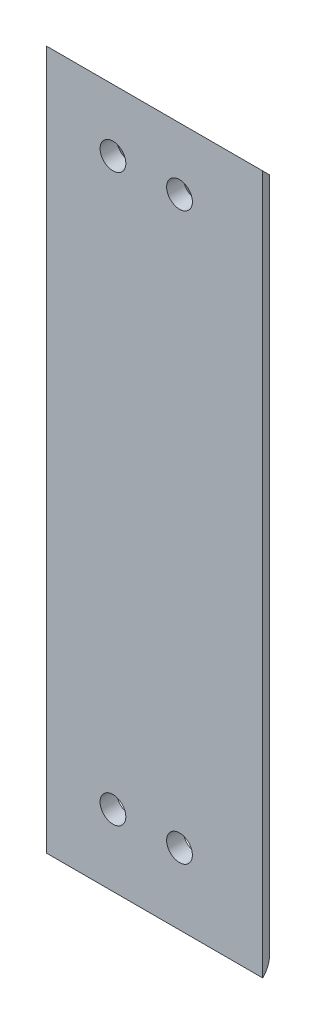
ISO-10303-21;
HEADER;
FILE_DESCRIPTION(('STEP AP214'),'2;1');
FILE_NAME('part.step','',(''),(''),'','','');
FILE_SCHEMA(('AUTOMOTIVE_DESIGN { 1 0 10303 214 1 1 1 1 }'));
ENDSEC;
DATA;
#1=APPLICATION_CONTEXT('core data for automotive mechanical design processes');
#2=APPLICATION_PROTOCOL_DEFINITION('international standard','automotive_design',2000,#1);
#3=PRODUCT_CONTEXT('',#1,'mechanical');
#4=PRODUCT('Part','Part','',(#3));
#5=PRODUCT_RELATED_PRODUCT_CATEGORY('part','',(#4));
#6=PRODUCT_DEFINITION_FORMATION('','',#4);
#7=PRODUCT_DEFINITION_CONTEXT('part definition',#1,'design');
#8=PRODUCT_DEFINITION('design','',#6,#7);
#9=PRODUCT_DEFINITION_SHAPE('','',#8);
#10=(LENGTH_UNIT() NAMED_UNIT(*) SI_UNIT(.MILLI.,.METRE.));
#11=(NAMED_UNIT(*) PLANE_ANGLE_UNIT() SI_UNIT($,.RADIAN.));
#12=(NAMED_UNIT(*) SI_UNIT($,.STERADIAN.) SOLID_ANGLE_UNIT());
#13=UNCERTAINTY_MEASURE_WITH_UNIT(LENGTH_MEASURE(1.E-05),#10,'distance_accuracy_value','');
#14=(GEOMETRIC_REPRESENTATION_CONTEXT(3) GLOBAL_UNCERTAINTY_ASSIGNED_CONTEXT((#13)) GLOBAL_UNIT_ASSIGNED_CONTEXT((#10,
#11,#12)) REPRESENTATION_CONTEXT('',''));
#15=CARTESIAN_POINT('',(0.,0.,0.));
#16=DIRECTION('',(0.,0.,1.));
#17=DIRECTION('',(1.,0.,0.));
#18=AXIS2_PLACEMENT_3D('',#15,#16,#17);
#19=CARTESIAN_POINT('',(0.,66.675,-28.575));
#20=DIRECTION('',(1.,0.,0.));
#21=DIRECTION('',(0.,0.,-1.));
#22=AXIS2_PLACEMENT_3D('',#19,#20,#21);
#23=PLANE('',#22);
#24=DIRECTION('',(0.,-1.,0.));
#25=VECTOR('',#24,1.);
#26=CARTESIAN_POINT('',(0.,66.675,0.));
#27=LINE('',#26,#25);
#28=CARTESIAN_POINT('',(0.,66.675,0.));
#29=VERTEX_POINT('',#28);
#30=CARTESIAN_POINT('',(0.,-66.675,0.));
#31=VERTEX_POINT('',#30);
#32=EDGE_CURVE('E121',#29,#31,#27,.T.);
#33=ORIENTED_EDGE('',*,*,#32,.F.);
#34=DIRECTION('',(0.,0.707106781186546,0.707106781186549));
#35=VECTOR('',#34,1.);
#36=CARTESIAN_POINT('',(0.,66.675,0.));
#37=LINE('',#36,#35);
#38=CARTESIAN_POINT('',(0.,38.1000000000001,-28.575));
#39=VERTEX_POINT('',#38);
#40=EDGE_CURVE('E101',#39,#29,#37,.T.);
#41=ORIENTED_EDGE('',*,*,#40,.F.);
#42=DIRECTION('',(0.,-1.,0.));
#43=VECTOR('',#42,1.);
#44=CARTESIAN_POINT('',(0.,66.675,-28.575));
#45=LINE('',#44,#43);
#46=CARTESIAN_POINT('',(0.,-38.0999999999997,-28.575));
#47=VERTEX_POINT('',#46);
#48=EDGE_CURVE('E66',#39,#47,#45,.T.);
#49=ORIENTED_EDGE('',*,*,#48,.T.);
#50=DIRECTION('',(0.,0.707106781186551,-0.707106781186544));
#51=VECTOR('',#50,1.);
#52=CARTESIAN_POINT('',(0.,-66.675,0.));
#53=LINE('',#52,#51);
#54=EDGE_CURVE('E116',#31,#47,#53,.T.);
#55=ORIENTED_EDGE('',*,*,#54,.F.);
#56=EDGE_LOOP('',(#33,#41,#49,#55));
#57=FACE_BOUND('',#56,.T.);
#58=ADVANCED_FACE('F44',(#57),#23,.F.);
#59=CARTESIAN_POINT('',(0.,66.675,0.));
#60=DIRECTION('',(0.,0.,-1.));
#61=DIRECTION('',(-1.,0.,0.));
#62=AXIS2_PLACEMENT_3D('',#59,#60,#61);
#63=PLANE('',#62);
#64=CARTESIAN_POINT('',(25.4,-53.0927816087114,0.));
#65=DIRECTION('',(0.,0.,-1.));
#66=DIRECTION('',(-1.,0.,0.));
#67=AXIS2_PLACEMENT_3D('',#64,#65,#66);
#68=CIRCLE('',#67,2.45745);
#69=CARTESIAN_POINT('',(22.94255,-53.0927816087114,0.));
#70=VERTEX_POINT('',#69);
#71=EDGE_CURVE('E209',#70,#70,#68,.T.);
#72=ORIENTED_EDGE('',*,*,#71,.T.);
#73=EDGE_LOOP('',(#72));
#74=FACE_BOUND('',#73,.T.);
#75=CARTESIAN_POINT('',(12.7,-53.0927816087114,0.));
#76=DIRECTION('',(0.,0.,-1.));
#77=DIRECTION('',(-1.,0.,0.));
#78=AXIS2_PLACEMENT_3D('',#75,#76,#77);
#79=CIRCLE('',#78,2.45745);
#80=CARTESIAN_POINT('',(10.24255,-53.0927816087114,0.));
#81=VERTEX_POINT('',#80);
#82=EDGE_CURVE('E218',#81,#81,#79,.T.);
#83=ORIENTED_EDGE('',*,*,#82,.T.);
#84=EDGE_LOOP('',(#83));
#85=FACE_BOUND('',#84,.T.);
#86=CARTESIAN_POINT('',(12.7000000000004,54.8572183912885,0.));
#87=DIRECTION('',(0.,0.,-1.));
#88=DIRECTION('',(-1.,0.,0.));
#89=AXIS2_PLACEMENT_3D('',#86,#87,#88);
#90=CIRCLE('',#89,2.45745);
#91=CARTESIAN_POINT('',(10.2425500000004,54.8572183912885,0.));
#92=VERTEX_POINT('',#91);
#93=EDGE_CURVE('E224',#92,#92,#90,.T.);
#94=ORIENTED_EDGE('',*,*,#93,.T.);
#95=EDGE_LOOP('',(#94));
#96=FACE_BOUND('',#95,.T.);
#97=CARTESIAN_POINT('',(25.4000000000004,54.8572183912885,0.));
#98=DIRECTION('',(0.,0.,-1.));
#99=DIRECTION('',(-1.,0.,0.));
#100=AXIS2_PLACEMENT_3D('',#97,#98,#99);
#101=CIRCLE('',#100,2.45745);
#102=CARTESIAN_POINT('',(22.9425500000004,54.8572183912885,0.));
#103=VERTEX_POINT('',#102);
#104=EDGE_CURVE('E146',#103,#103,#101,.T.);
#105=ORIENTED_EDGE('',*,*,#104,.T.);
#106=EDGE_LOOP('',(#105));
#107=FACE_BOUND('',#106,.T.);
#108=DIRECTION('',(1.,0.,0.));
#109=VECTOR('',#108,1.);
#110=CARTESIAN_POINT('',(0.,-66.675,0.));
#111=LINE('',#110,#109);
#112=CARTESIAN_POINT('',(41.275,-66.675,0.));
#113=VERTEX_POINT('',#112);
#114=EDGE_CURVE('E107',#31,#113,#111,.T.);
#115=ORIENTED_EDGE('',*,*,#114,.T.);
#116=DIRECTION('',(0.,-1.,0.));
#117=VECTOR('',#116,1.);
#118=CARTESIAN_POINT('',(41.275,66.675,0.));
#119=LINE('',#118,#117);
#120=CARTESIAN_POINT('',(41.275,66.675,0.));
#121=VERTEX_POINT('',#120);
#122=EDGE_CURVE('E114',#121,#113,#119,.T.);
#123=ORIENTED_EDGE('',*,*,#122,.F.);
#124=DIRECTION('',(1.,0.,0.));
#125=VECTOR('',#124,1.);
#126=CARTESIAN_POINT('',(0.,66.675,0.));
#127=LINE('',#126,#125);
#128=EDGE_CURVE('E96',#29,#121,#127,.T.);
#129=ORIENTED_EDGE('',*,*,#128,.F.);
#130=ORIENTED_EDGE('',*,*,#32,.T.);
#131=EDGE_LOOP('',(#115,#123,#129,#130));
#132=FACE_BOUND('',#131,.T.);
#133=ADVANCED_FACE('F120',(#74,#85,#96,#107,#132),#63,.F.);
#134=CARTESIAN_POINT('',(41.275,66.675,-3.175));
#135=DIRECTION('',(0.,0.,1.));
#136=DIRECTION('',(1.,0.,0.));
#137=AXIS2_PLACEMENT_3D('',#134,#135,#136);
#138=PLANE('',#137);
#139=CARTESIAN_POINT('',(25.4,-53.0927816087114,-3.175));
#140=DIRECTION('',(0.,0.,-1.));
#141=DIRECTION('',(-1.,0.,0.));
#142=AXIS2_PLACEMENT_3D('',#139,#140,#141);
#143=CIRCLE('',#142,2.45744999999999);
#144=CARTESIAN_POINT('',(22.94255,-53.0927816087114,-3.175));
#145=VERTEX_POINT('',#144);
#146=EDGE_CURVE('E211',#145,#145,#143,.T.);
#147=ORIENTED_EDGE('',*,*,#146,.F.);
#148=EDGE_LOOP('',(#147));
#149=FACE_BOUND('',#148,.T.);
#150=CARTESIAN_POINT('',(12.7,-53.0927816087114,-3.17499999999999));
#151=DIRECTION('',(0.,0.,-1.));
#152=DIRECTION('',(-1.,0.,0.));
#153=AXIS2_PLACEMENT_3D('',#150,#151,#152);
#154=CIRCLE('',#153,2.45744999999999);
#155=CARTESIAN_POINT('',(10.24255,-53.0927816087114,-3.17499999999999));
#156=VERTEX_POINT('',#155);
#157=EDGE_CURVE('E213',#156,#156,#154,.T.);
#158=ORIENTED_EDGE('',*,*,#157,.F.);
#159=EDGE_LOOP('',(#158));
#160=FACE_BOUND('',#159,.T.);
#161=CARTESIAN_POINT('',(12.7000000000004,54.8572183912885,-3.17499999999999));
#162=DIRECTION('',(0.,0.,-1.));
#163=DIRECTION('',(-1.,0.,0.));
#164=AXIS2_PLACEMENT_3D('',#161,#162,#163);
#165=CIRCLE('',#164,2.45744999999999);
#166=CARTESIAN_POINT('',(10.2425500000004,54.8572183912885,-3.17499999999999));
#167=VERTEX_POINT('',#166);
#168=EDGE_CURVE('E221',#167,#167,#165,.T.);
#169=ORIENTED_EDGE('',*,*,#168,.F.);
#170=EDGE_LOOP('',(#169));
#171=FACE_BOUND('',#170,.T.);
#172=CARTESIAN_POINT('',(25.4000000000004,54.8572183912885,-3.175));
#173=DIRECTION('',(0.,0.,-1.));
#174=DIRECTION('',(-1.,0.,0.));
#175=AXIS2_PLACEMENT_3D('',#172,#173,#174);
#176=CIRCLE('',#175,2.45744999999999);
#177=CARTESIAN_POINT('',(22.9425500000004,54.8572183912885,-3.175));
#178=VERTEX_POINT('',#177);
#179=EDGE_CURVE('E150',#178,#178,#176,.T.);
#180=ORIENTED_EDGE('',*,*,#179,.F.);
#181=EDGE_LOOP('',(#180));
#182=FACE_BOUND('',#181,.T.);
#183=DIRECTION('',(0.,-1.,0.));
#184=VECTOR('',#183,1.);
#185=CARTESIAN_POINT('',(3.175,66.675,-3.17499999999999));
#186=LINE('',#185,#184);
#187=CARTESIAN_POINT('',(3.175,63.5,-3.17499999999999));
#188=VERTEX_POINT('',#187);
#189=CARTESIAN_POINT('',(3.175,-63.5,-3.175));
#190=VERTEX_POINT('',#189);
#191=EDGE_CURVE('E106',#188,#190,#186,.T.);
#192=ORIENTED_EDGE('',*,*,#191,.F.);
#193=DIRECTION('',(1.,0.,0.));
#194=VECTOR('',#193,1.);
#195=CARTESIAN_POINT('',(41.275,63.5,-3.175));
#196=LINE('',#195,#194);
#197=CARTESIAN_POINT('',(38.1,63.5,-3.175));
#198=VERTEX_POINT('',#197);
#199=EDGE_CURVE('E117',#188,#198,#196,.T.);
#200=ORIENTED_EDGE('',*,*,#199,.T.);
#201=DIRECTION('',(0.,-1.,0.));
#202=VECTOR('',#201,1.);
#203=CARTESIAN_POINT('',(38.1,66.675,-3.175));
#204=LINE('',#203,#202);
#205=CARTESIAN_POINT('',(38.1,-63.5,-3.175));
#206=VERTEX_POINT('',#205);
#207=EDGE_CURVE('E115',#198,#206,#204,.T.);
#208=ORIENTED_EDGE('',*,*,#207,.T.);
#209=DIRECTION('',(-1.,0.,0.));
#210=VECTOR('',#209,1.);
#211=CARTESIAN_POINT('',(41.275,-63.5,-3.175));
#212=LINE('',#211,#210);
#213=EDGE_CURVE('E144',#206,#190,#212,.T.);
#214=ORIENTED_EDGE('',*,*,#213,.T.);
#215=EDGE_LOOP('',(#192,#200,#208,#214));
#216=FACE_BOUND('',#215,.T.);
#217=ADVANCED_FACE('F159',(#149,#160,#171,#182,#216),#138,.F.);
#218=CARTESIAN_POINT('',(3.175,66.675,-3.17499999999999));
#219=DIRECTION('',(-1.,0.,0.));
#220=DIRECTION('',(0.,0.,1.));
#221=AXIS2_PLACEMENT_3D('',#218,#219,#220);
#222=PLANE('',#221);
#223=DIRECTION('',(0.,-1.,0.));
#224=VECTOR('',#223,1.);
#225=CARTESIAN_POINT('',(3.17499999999999,66.675,-25.4));
#226=LINE('',#225,#224);
#227=CARTESIAN_POINT('',(3.17499999999999,-41.2749999999997,-25.4));
#228=VERTEX_POINT('',#227);
#229=CARTESIAN_POINT('',(3.17499999999999,41.2750000000001,-25.4));
#230=VERTEX_POINT('',#229);
#231=EDGE_CURVE('E129',#228,#230,#226,.F.);
#232=ORIENTED_EDGE('',*,*,#231,.T.);
#233=DIRECTION('',(0.,0.707106781186546,0.707106781186549));
#234=VECTOR('',#233,1.);
#235=CARTESIAN_POINT('',(3.175,65.0875,-1.5875));
#236=LINE('',#235,#234);
#237=EDGE_CURVE('E58',#230,#188,#236,.T.);
#238=ORIENTED_EDGE('',*,*,#237,.T.);
#239=ORIENTED_EDGE('',*,*,#191,.T.);
#240=DIRECTION('',(0.,0.707106781186551,-0.707106781186544));
#241=VECTOR('',#240,1.);
#242=CARTESIAN_POINT('',(3.17499999999998,1.58750000000069,-68.2625));
#243=LINE('',#242,#241);
#244=EDGE_CURVE('E137',#190,#228,#243,.T.);
#245=ORIENTED_EDGE('',*,*,#244,.T.);
#246=EDGE_LOOP('',(#232,#238,#239,#245));
#247=FACE_BOUND('',#246,.T.);
#248=ADVANCED_FACE('F142',(#247),#222,.F.);
#249=CARTESIAN_POINT('',(38.1,66.675,0.));
#250=DIRECTION('',(0.,-1.,0.));
#251=DIRECTION('',(0.,0.,-1.));
#252=AXIS2_PLACEMENT_3D('',#249,#250,#251);
#253=CYLINDRICAL_SURFACE('',#252,3.175);
#254=CARTESIAN_POINT('',(38.1,66.675,0.));
#255=DIRECTION('',(0.,-0.707106781186549,0.707106781186546));
#256=DIRECTION('',(0.,-0.707106781186546,-0.707106781186549));
#257=AXIS2_PLACEMENT_3D('',#254,#255,#256);
#258=ELLIPSE('',#257,4.49012806053457,3.175);
#259=EDGE_CURVE('E99',#121,#198,#258,.F.);
#260=ORIENTED_EDGE('',*,*,#259,.F.);
#261=ORIENTED_EDGE('',*,*,#122,.T.);
#262=CARTESIAN_POINT('',(38.1,-66.675,0.));
#263=DIRECTION('',(0.,0.707106781186544,0.707106781186551));
#264=DIRECTION('',(0.,-0.707106781186551,0.707106781186544));
#265=AXIS2_PLACEMENT_3D('',#262,#263,#264);
#266=ELLIPSE('',#265,4.4901280605346,3.175);
#267=EDGE_CURVE('E157',#206,#113,#266,.F.);
#268=ORIENTED_EDGE('',*,*,#267,.F.);
#269=ORIENTED_EDGE('',*,*,#207,.F.);
#270=EDGE_LOOP('',(#260,#261,#268,#269));
#271=FACE_BOUND('',#270,.T.);
#272=ADVANCED_FACE('F112',(#271),#253,.T.);
#273=CARTESIAN_POINT('',(0.,66.675,-25.4));
#274=DIRECTION('',(0.,-1.,0.));
#275=DIRECTION('',(0.,0.,-1.));
#276=AXIS2_PLACEMENT_3D('',#273,#274,#275);
#277=CYLINDRICAL_SURFACE('',#276,3.175);
#278=CARTESIAN_POINT('',(0.,41.2750000000001,-25.4));
#279=DIRECTION('',(0.,-0.707106781186549,0.707106781186546));
#280=DIRECTION('',(0.,-0.707106781186546,-0.707106781186549));
#281=AXIS2_PLACEMENT_3D('',#278,#279,#280);
#282=ELLIPSE('',#281,4.49012806053457,3.175);
#283=EDGE_CURVE('E13',#230,#39,#282,.F.);
#284=ORIENTED_EDGE('',*,*,#283,.F.);
#285=ORIENTED_EDGE('',*,*,#231,.F.);
#286=CARTESIAN_POINT('',(0.,-41.2749999999997,-25.4));
#287=DIRECTION('',(0.,0.707106781186544,0.707106781186551));
#288=DIRECTION('',(0.,-0.707106781186551,0.707106781186544));
#289=AXIS2_PLACEMENT_3D('',#286,#287,#288);
#290=ELLIPSE('',#289,4.4901280605346,3.175);
#291=EDGE_CURVE('E52',#47,#228,#290,.F.);
#292=ORIENTED_EDGE('',*,*,#291,.F.);
#293=ORIENTED_EDGE('',*,*,#48,.F.);
#294=EDGE_LOOP('',(#284,#285,#292,#293));
#295=FACE_BOUND('',#294,.T.);
#296=ADVANCED_FACE('F46',(#295),#277,.T.);
#297=CARTESIAN_POINT('',(41.275,-66.675,0.));
#298=DIRECTION('',(0.,0.707106781186544,0.707106781186551));
#299=DIRECTION('',(0.,-0.707106781186551,0.707106781186544));
#300=AXIS2_PLACEMENT_3D('',#297,#298,#299);
#301=PLANE('',#300);
#302=ORIENTED_EDGE('',*,*,#267,.T.);
#303=ORIENTED_EDGE('',*,*,#114,.F.);
#304=ORIENTED_EDGE('',*,*,#54,.T.);
#305=ORIENTED_EDGE('',*,*,#291,.T.);
#306=ORIENTED_EDGE('',*,*,#244,.F.);
#307=ORIENTED_EDGE('',*,*,#213,.F.);
#308=EDGE_LOOP('',(#302,#303,#304,#305,#306,#307));
#309=FACE_BOUND('',#308,.T.);
#310=ADVANCED_FACE('F135',(#309),#301,.F.);
#311=CARTESIAN_POINT('',(41.275,66.675,0.));
#312=DIRECTION('',(0.,-0.707106781186549,0.707106781186546));
#313=DIRECTION('',(0.,-0.707106781186546,-0.707106781186549));
#314=AXIS2_PLACEMENT_3D('',#311,#312,#313);
#315=PLANE('',#314);
#316=ORIENTED_EDGE('',*,*,#259,.T.);
#317=ORIENTED_EDGE('',*,*,#199,.F.);
#318=ORIENTED_EDGE('',*,*,#237,.F.);
#319=ORIENTED_EDGE('',*,*,#283,.T.);
#320=ORIENTED_EDGE('',*,*,#40,.T.);
#321=ORIENTED_EDGE('',*,*,#128,.T.);
#322=EDGE_LOOP('',(#316,#317,#318,#319,#320,#321));
#323=FACE_BOUND('',#322,.T.);
#324=ADVANCED_FACE('F98',(#323),#315,.F.);
#325=CARTESIAN_POINT('',(25.4000000000004,54.8572183912885,-3.175));
#326=DIRECTION('',(0.,0.,-1.));
#327=DIRECTION('',(-1.,0.,0.));
#328=AXIS2_PLACEMENT_3D('',#325,#326,#327);
#329=CYLINDRICAL_SURFACE('',#328,2.45744999999999);
#330=ORIENTED_EDGE('',*,*,#104,.F.);
#331=EDGE_LOOP('',(#330));
#332=FACE_BOUND('',#331,.T.);
#333=ORIENTED_EDGE('',*,*,#179,.T.);
#334=EDGE_LOOP('',(#333));
#335=FACE_BOUND('',#334,.T.);
#336=ADVANCED_FACE('F187',(#332,#335),#329,.F.);
#337=CARTESIAN_POINT('',(12.7000000000004,54.8572183912885,-3.17499999999999));
#338=DIRECTION('',(0.,0.,-1.));
#339=DIRECTION('',(-1.,0.,0.));
#340=AXIS2_PLACEMENT_3D('',#337,#338,#339);
#341=CYLINDRICAL_SURFACE('',#340,2.45744999999999);
#342=ORIENTED_EDGE('',*,*,#93,.F.);
#343=EDGE_LOOP('',(#342));
#344=FACE_BOUND('',#343,.T.);
#345=ORIENTED_EDGE('',*,*,#168,.T.);
#346=EDGE_LOOP('',(#345));
#347=FACE_BOUND('',#346,.T.);
#348=ADVANCED_FACE('F192',(#344,#347),#341,.F.);
#349=CARTESIAN_POINT('',(12.7,-53.0927816087114,-3.17499999999999));
#350=DIRECTION('',(0.,0.,-1.));
#351=DIRECTION('',(-1.,0.,0.));
#352=AXIS2_PLACEMENT_3D('',#349,#350,#351);
#353=CYLINDRICAL_SURFACE('',#352,2.45744999999999);
#354=ORIENTED_EDGE('',*,*,#82,.F.);
#355=EDGE_LOOP('',(#354));
#356=FACE_BOUND('',#355,.T.);
#357=ORIENTED_EDGE('',*,*,#157,.T.);
#358=EDGE_LOOP('',(#357));
#359=FACE_BOUND('',#358,.T.);
#360=ADVANCED_FACE('F196',(#356,#359),#353,.F.);
#361=CARTESIAN_POINT('',(25.4,-53.0927816087114,-3.175));
#362=DIRECTION('',(0.,0.,-1.));
#363=DIRECTION('',(-1.,0.,0.));
#364=AXIS2_PLACEMENT_3D('',#361,#362,#363);
#365=CYLINDRICAL_SURFACE('',#364,2.45744999999999);
#366=ORIENTED_EDGE('',*,*,#71,.F.);
#367=EDGE_LOOP('',(#366));
#368=FACE_BOUND('',#367,.T.);
#369=ORIENTED_EDGE('',*,*,#146,.T.);
#370=EDGE_LOOP('',(#369));
#371=FACE_BOUND('',#370,.T.);
#372=ADVANCED_FACE('F200',(#368,#371),#365,.F.);
#373=CLOSED_SHELL('',(#58,#133,#217,#248,#272,#296,#310,#324,#336,#348,#360,#372));
#374=MANIFOLD_SOLID_BREP('B2',#373);
#375=ADVANCED_BREP_SHAPE_REPRESENTATION('',(#18,#374),#14);
#376=SHAPE_DEFINITION_REPRESENTATION(#9,#375);
ENDSEC;
END-ISO-10303-21;
